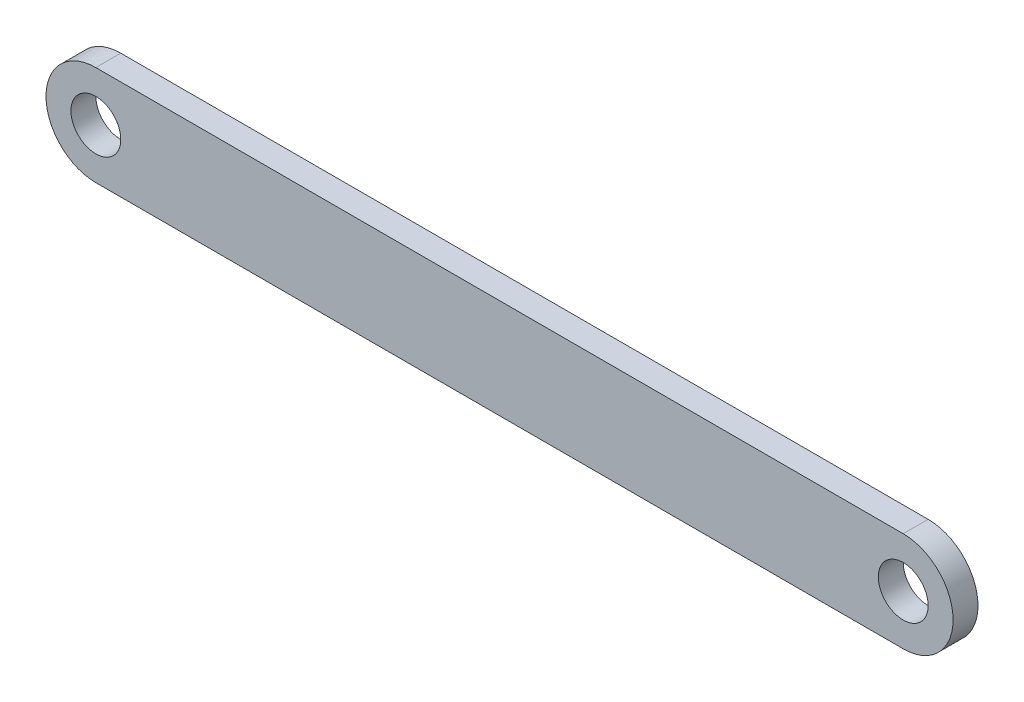
ISO-10303-21;
HEADER;
FILE_DESCRIPTION(('STEP AP214'),'2;1');
FILE_NAME('part.step','',(''),(''),'','','');
FILE_SCHEMA(('AUTOMOTIVE_DESIGN { 1 0 10303 214 1 1 1 1 }'));
ENDSEC;
DATA;
#1=APPLICATION_CONTEXT('core data for automotive mechanical design processes');
#2=APPLICATION_PROTOCOL_DEFINITION('international standard','automotive_design',2000,#1);
#3=PRODUCT_CONTEXT('',#1,'mechanical');
#4=PRODUCT('Part','Part','',(#3));
#5=PRODUCT_RELATED_PRODUCT_CATEGORY('part','',(#4));
#6=PRODUCT_DEFINITION_FORMATION('','',#4);
#7=PRODUCT_DEFINITION_CONTEXT('part definition',#1,'design');
#8=PRODUCT_DEFINITION('design','',#6,#7);
#9=PRODUCT_DEFINITION_SHAPE('','',#8);
#10=(LENGTH_UNIT() NAMED_UNIT(*) SI_UNIT(.MILLI.,.METRE.));
#11=(NAMED_UNIT(*) PLANE_ANGLE_UNIT() SI_UNIT($,.RADIAN.));
#12=(NAMED_UNIT(*) SI_UNIT($,.STERADIAN.) SOLID_ANGLE_UNIT());
#13=UNCERTAINTY_MEASURE_WITH_UNIT(LENGTH_MEASURE(1.E-05),#10,'distance_accuracy_value','');
#14=(GEOMETRIC_REPRESENTATION_CONTEXT(3) GLOBAL_UNCERTAINTY_ASSIGNED_CONTEXT((#13)) GLOBAL_UNIT_ASSIGNED_CONTEXT((#10,
#11,#12)) REPRESENTATION_CONTEXT('',''));
#15=CARTESIAN_POINT('',(0.,0.,0.));
#16=DIRECTION('',(0.,0.,1.));
#17=DIRECTION('',(1.,0.,0.));
#18=AXIS2_PLACEMENT_3D('',#15,#16,#17);
#19=CARTESIAN_POINT('',(0.,-2.,0.5));
#20=DIRECTION('',(0.,1.,0.));
#21=DIRECTION('',(-1.,0.,0.));
#22=AXIS2_PLACEMENT_3D('',#19,#20,#21);
#23=PLANE('',#22);
#24=DIRECTION('',(1.,0.,0.));
#25=VECTOR('',#24,1.);
#26=CARTESIAN_POINT('',(0.,-2.,-0.5));
#27=LINE('',#26,#25);
#28=CARTESIAN_POINT('',(-32.398,-2.,-0.5));
#29=VERTEX_POINT('',#28);
#30=CARTESIAN_POINT('',(0.,-2.,-0.5));
#31=VERTEX_POINT('',#30);
#32=EDGE_CURVE('E108',#29,#31,#27,.T.);
#33=ORIENTED_EDGE('',*,*,#32,.T.);
#34=DIRECTION('',(0.,0.,-1.));
#35=VECTOR('',#34,1.);
#36=CARTESIAN_POINT('',(0.,-2.,0.5));
#37=LINE('',#36,#35);
#38=CARTESIAN_POINT('',(0.,-2.,0.5));
#39=VERTEX_POINT('',#38);
#40=EDGE_CURVE('E11',#39,#31,#37,.T.);
#41=ORIENTED_EDGE('',*,*,#40,.F.);
#42=DIRECTION('',(1.,0.,0.));
#43=VECTOR('',#42,1.);
#44=CARTESIAN_POINT('',(0.,-2.,0.5));
#45=LINE('',#44,#43);
#46=CARTESIAN_POINT('',(-32.398,-2.,0.5));
#47=VERTEX_POINT('',#46);
#48=EDGE_CURVE('E87',#47,#39,#45,.T.);
#49=ORIENTED_EDGE('',*,*,#48,.F.);
#50=DIRECTION('',(0.,0.,-1.));
#51=VECTOR('',#50,1.);
#52=CARTESIAN_POINT('',(-32.398,-2.,0.5));
#53=LINE('',#52,#51);
#54=EDGE_CURVE('E107',#47,#29,#53,.T.);
#55=ORIENTED_EDGE('',*,*,#54,.T.);
#56=EDGE_LOOP('',(#33,#41,#49,#55));
#57=FACE_BOUND('',#56,.T.);
#58=ADVANCED_FACE('F39',(#57),#23,.F.);
#59=CARTESIAN_POINT('',(0.,0.,0.5));
#60=DIRECTION('',(0.,0.,-1.));
#61=DIRECTION('',(-1.,0.,0.));
#62=AXIS2_PLACEMENT_3D('',#59,#60,#61);
#63=CYLINDRICAL_SURFACE('',#62,2.);
#64=CARTESIAN_POINT('',(0.,0.,-0.5));
#65=DIRECTION('',(0.,0.,1.));
#66=DIRECTION('',(1.,0.,0.));
#67=AXIS2_PLACEMENT_3D('',#64,#65,#66);
#68=CIRCLE('',#67,2.);
#69=CARTESIAN_POINT('',(0.,2.,-0.5));
#70=VERTEX_POINT('',#69);
#71=EDGE_CURVE('E92',#31,#70,#68,.T.);
#72=ORIENTED_EDGE('',*,*,#71,.T.);
#73=DIRECTION('',(0.,0.,-1.));
#74=VECTOR('',#73,1.);
#75=CARTESIAN_POINT('',(0.,2.,0.5));
#76=LINE('',#75,#74);
#77=CARTESIAN_POINT('',(0.,2.,0.5));
#78=VERTEX_POINT('',#77);
#79=EDGE_CURVE('E47',#78,#70,#76,.T.);
#80=ORIENTED_EDGE('',*,*,#79,.F.);
#81=CARTESIAN_POINT('',(0.,0.,0.5));
#82=DIRECTION('',(0.,0.,1.));
#83=DIRECTION('',(1.,0.,0.));
#84=AXIS2_PLACEMENT_3D('',#81,#82,#83);
#85=CIRCLE('',#84,2.);
#86=EDGE_CURVE('E81',#39,#78,#85,.T.);
#87=ORIENTED_EDGE('',*,*,#86,.F.);
#88=ORIENTED_EDGE('',*,*,#40,.T.);
#89=EDGE_LOOP('',(#72,#80,#87,#88));
#90=FACE_BOUND('',#89,.T.);
#91=ADVANCED_FACE('F91',(#90),#63,.T.);
#92=CARTESIAN_POINT('',(0.,2.,0.5));
#93=DIRECTION('',(0.,1.,0.));
#94=DIRECTION('',(-1.,0.,0.));
#95=AXIS2_PLACEMENT_3D('',#92,#93,#94);
#96=PLANE('',#95);
#97=DIRECTION('',(1.,0.,0.));
#98=VECTOR('',#97,1.);
#99=CARTESIAN_POINT('',(0.,2.,-0.5));
#100=LINE('',#99,#98);
#101=CARTESIAN_POINT('',(-32.398,2.,-0.5));
#102=VERTEX_POINT('',#101);
#103=EDGE_CURVE('E112',#102,#70,#100,.T.);
#104=ORIENTED_EDGE('',*,*,#103,.F.);
#105=DIRECTION('',(0.,0.,-1.));
#106=VECTOR('',#105,1.);
#107=CARTESIAN_POINT('',(-32.398,2.,0.5));
#108=LINE('',#107,#106);
#109=CARTESIAN_POINT('',(-32.398,2.,0.5));
#110=VERTEX_POINT('',#109);
#111=EDGE_CURVE('E71',#110,#102,#108,.T.);
#112=ORIENTED_EDGE('',*,*,#111,.F.);
#113=DIRECTION('',(1.,0.,0.));
#114=VECTOR('',#113,1.);
#115=CARTESIAN_POINT('',(0.,2.,0.5));
#116=LINE('',#115,#114);
#117=EDGE_CURVE('E85',#110,#78,#116,.T.);
#118=ORIENTED_EDGE('',*,*,#117,.T.);
#119=ORIENTED_EDGE('',*,*,#79,.T.);
#120=EDGE_LOOP('',(#104,#112,#118,#119));
#121=FACE_BOUND('',#120,.T.);
#122=ADVANCED_FACE('F96',(#121),#96,.T.);
#123=CARTESIAN_POINT('',(-32.398,0.,0.5));
#124=DIRECTION('',(0.,0.,-1.));
#125=DIRECTION('',(-1.,0.,0.));
#126=AXIS2_PLACEMENT_3D('',#123,#124,#125);
#127=CYLINDRICAL_SURFACE('',#126,0.999999999999998);
#128=CARTESIAN_POINT('',(-32.398,0.,0.5));
#129=DIRECTION('',(0.,0.,1.));
#130=DIRECTION('',(1.,0.,0.));
#131=AXIS2_PLACEMENT_3D('',#128,#129,#130);
#132=CIRCLE('',#131,0.999999999999998);
#133=CARTESIAN_POINT('',(-31.398,0.,0.5));
#134=VERTEX_POINT('',#133);
#135=EDGE_CURVE('E98',#134,#134,#132,.T.);
#136=ORIENTED_EDGE('',*,*,#135,.T.);
#137=EDGE_LOOP('',(#136));
#138=FACE_BOUND('',#137,.T.);
#139=CARTESIAN_POINT('',(-32.398,0.,-0.5));
#140=DIRECTION('',(0.,0.,1.));
#141=DIRECTION('',(1.,0.,0.));
#142=AXIS2_PLACEMENT_3D('',#139,#140,#141);
#143=CIRCLE('',#142,0.999999999999998);
#144=CARTESIAN_POINT('',(-31.398,0.,-0.5));
#145=VERTEX_POINT('',#144);
#146=EDGE_CURVE('E115',#145,#145,#143,.T.);
#147=ORIENTED_EDGE('',*,*,#146,.F.);
#148=EDGE_LOOP('',(#147));
#149=FACE_BOUND('',#148,.T.);
#150=ADVANCED_FACE('F143',(#138,#149),#127,.F.);
#151=CARTESIAN_POINT('',(-32.398,0.,0.5));
#152=DIRECTION('',(0.,0.,-1.));
#153=DIRECTION('',(-1.,0.,0.));
#154=AXIS2_PLACEMENT_3D('',#151,#152,#153);
#155=CYLINDRICAL_SURFACE('',#154,2.);
#156=CARTESIAN_POINT('',(-32.398,0.,-0.5));
#157=DIRECTION('',(0.,0.,1.));
#158=DIRECTION('',(1.,0.,0.));
#159=AXIS2_PLACEMENT_3D('',#156,#157,#158);
#160=CIRCLE('',#159,2.);
#161=EDGE_CURVE('E74',#102,#29,#160,.T.);
#162=ORIENTED_EDGE('',*,*,#161,.T.);
#163=ORIENTED_EDGE('',*,*,#54,.F.);
#164=CARTESIAN_POINT('',(-32.398,0.,0.5));
#165=DIRECTION('',(0.,0.,1.));
#166=DIRECTION('',(1.,0.,0.));
#167=AXIS2_PLACEMENT_3D('',#164,#165,#166);
#168=CIRCLE('',#167,2.);
#169=EDGE_CURVE('E55',#110,#47,#168,.T.);
#170=ORIENTED_EDGE('',*,*,#169,.F.);
#171=ORIENTED_EDGE('',*,*,#111,.T.);
#172=EDGE_LOOP('',(#162,#163,#170,#171));
#173=FACE_BOUND('',#172,.T.);
#174=ADVANCED_FACE('F135',(#173),#155,.T.);
#175=CARTESIAN_POINT('',(0.,0.,0.5));
#176=DIRECTION('',(0.,0.,-1.));
#177=DIRECTION('',(-1.,0.,0.));
#178=AXIS2_PLACEMENT_3D('',#175,#176,#177);
#179=CYLINDRICAL_SURFACE('',#178,1.);
#180=CARTESIAN_POINT('',(0.,0.,0.5));
#181=DIRECTION('',(0.,0.,1.));
#182=DIRECTION('',(1.,0.,0.));
#183=AXIS2_PLACEMENT_3D('',#180,#181,#182);
#184=CIRCLE('',#183,1.);
#185=CARTESIAN_POINT('',(1.,0.,0.5));
#186=VERTEX_POINT('',#185);
#187=EDGE_CURVE('E104',#186,#186,#184,.T.);
#188=ORIENTED_EDGE('',*,*,#187,.T.);
#189=EDGE_LOOP('',(#188));
#190=FACE_BOUND('',#189,.T.);
#191=CARTESIAN_POINT('',(0.,0.,-0.5));
#192=DIRECTION('',(0.,0.,1.));
#193=DIRECTION('',(1.,0.,0.));
#194=AXIS2_PLACEMENT_3D('',#191,#192,#193);
#195=CIRCLE('',#194,1.);
#196=CARTESIAN_POINT('',(1.,0.,-0.5));
#197=VERTEX_POINT('',#196);
#198=EDGE_CURVE('E118',#197,#197,#195,.T.);
#199=ORIENTED_EDGE('',*,*,#198,.F.);
#200=EDGE_LOOP('',(#199));
#201=FACE_BOUND('',#200,.T.);
#202=ADVANCED_FACE('F133',(#190,#201),#179,.F.);
#203=CARTESIAN_POINT('',(0.,0.,0.5));
#204=DIRECTION('',(0.,0.,1.));
#205=DIRECTION('',(1.,0.,0.));
#206=AXIS2_PLACEMENT_3D('',#203,#204,#205);
#207=PLANE('',#206);
#208=ORIENTED_EDGE('',*,*,#48,.T.);
#209=ORIENTED_EDGE('',*,*,#86,.T.);
#210=ORIENTED_EDGE('',*,*,#117,.F.);
#211=ORIENTED_EDGE('',*,*,#169,.T.);
#212=EDGE_LOOP('',(#208,#209,#210,#211));
#213=FACE_BOUND('',#212,.T.);
#214=ORIENTED_EDGE('',*,*,#135,.F.);
#215=EDGE_LOOP('',(#214));
#216=FACE_BOUND('',#215,.T.);
#217=ORIENTED_EDGE('',*,*,#187,.F.);
#218=EDGE_LOOP('',(#217));
#219=FACE_BOUND('',#218,.T.);
#220=ADVANCED_FACE('F82',(#213,#216,#219),#207,.T.);
#221=CARTESIAN_POINT('',(0.,0.,-0.5));
#222=DIRECTION('',(0.,0.,1.));
#223=DIRECTION('',(1.,0.,0.));
#224=AXIS2_PLACEMENT_3D('',#221,#222,#223);
#225=PLANE('',#224);
#226=ORIENTED_EDGE('',*,*,#32,.F.);
#227=ORIENTED_EDGE('',*,*,#161,.F.);
#228=ORIENTED_EDGE('',*,*,#103,.T.);
#229=ORIENTED_EDGE('',*,*,#71,.F.);
#230=EDGE_LOOP('',(#226,#227,#228,#229));
#231=FACE_BOUND('',#230,.T.);
#232=ORIENTED_EDGE('',*,*,#146,.T.);
#233=EDGE_LOOP('',(#232));
#234=FACE_BOUND('',#233,.T.);
#235=ORIENTED_EDGE('',*,*,#198,.T.);
#236=EDGE_LOOP('',(#235));
#237=FACE_BOUND('',#236,.T.);
#238=ADVANCED_FACE('F125',(#231,#234,#237),#225,.F.);
#239=CLOSED_SHELL('',(#58,#91,#122,#150,#174,#202,#220,#238));
#240=MANIFOLD_SOLID_BREP('B2',#239);
#241=ADVANCED_BREP_SHAPE_REPRESENTATION('',(#18,#240),#14);
#242=SHAPE_DEFINITION_REPRESENTATION(#9,#241);
ENDSEC;
END-ISO-10303-21;
